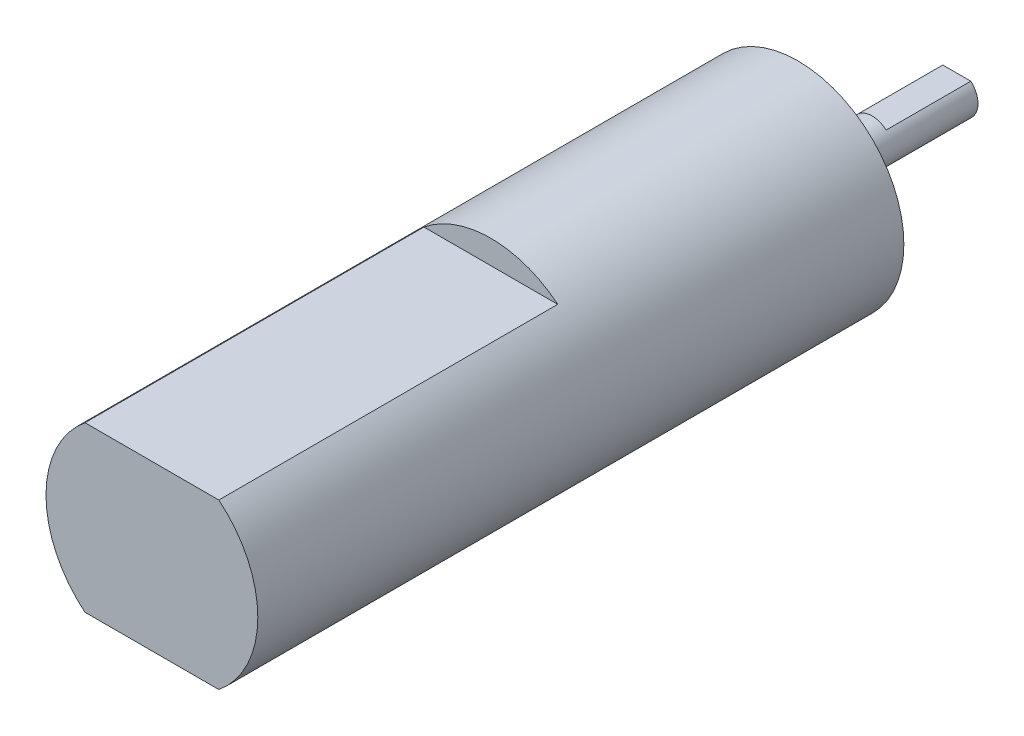
ISO-10303-21;
HEADER;
FILE_DESCRIPTION(('STEP AP214'),'2;1');
FILE_NAME('part.step','',(''),(''),'','','');
FILE_SCHEMA(('AUTOMOTIVE_DESIGN { 1 0 10303 214 1 1 1 1 }'));
ENDSEC;
DATA;
#1=APPLICATION_CONTEXT('core data for automotive mechanical design processes');
#2=APPLICATION_PROTOCOL_DEFINITION('international standard','automotive_design',2000,#1);
#3=PRODUCT_CONTEXT('',#1,'mechanical');
#4=PRODUCT('Part','Part','',(#3));
#5=PRODUCT_RELATED_PRODUCT_CATEGORY('part','',(#4));
#6=PRODUCT_DEFINITION_FORMATION('','',#4);
#7=PRODUCT_DEFINITION_CONTEXT('part definition',#1,'design');
#8=PRODUCT_DEFINITION('design','',#6,#7);
#9=PRODUCT_DEFINITION_SHAPE('','',#8);
#10=(LENGTH_UNIT() NAMED_UNIT(*) SI_UNIT(.MILLI.,.METRE.));
#11=(NAMED_UNIT(*) PLANE_ANGLE_UNIT() SI_UNIT($,.RADIAN.));
#12=(NAMED_UNIT(*) SI_UNIT($,.STERADIAN.) SOLID_ANGLE_UNIT());
#13=UNCERTAINTY_MEASURE_WITH_UNIT(LENGTH_MEASURE(1.E-05),#10,'distance_accuracy_value','');
#14=(GEOMETRIC_REPRESENTATION_CONTEXT(3) GLOBAL_UNCERTAINTY_ASSIGNED_CONTEXT((#13)) GLOBAL_UNIT_ASSIGNED_CONTEXT((#10,
#11,#12)) REPRESENTATION_CONTEXT('',''));
#15=CARTESIAN_POINT('',(0.,0.,0.));
#16=DIRECTION('',(0.,0.,1.));
#17=DIRECTION('',(1.,0.,0.));
#18=AXIS2_PLACEMENT_3D('',#15,#16,#17);
#19=CARTESIAN_POINT('',(0.,0.,-29.));
#20=DIRECTION('',(0.,0.,1.));
#21=DIRECTION('',(1.,0.,0.));
#22=AXIS2_PLACEMENT_3D('',#19,#20,#21);
#23=CYLINDRICAL_SURFACE('',#22,10.);
#24=DIRECTION('',(0.,0.,1.));
#25=VECTOR('',#24,1.);
#26=CARTESIAN_POINT('',(-6.31961232988226,-7.75,-12.8379320764678));
#27=LINE('',#26,#25);
#28=CARTESIAN_POINT('',(-6.31961232988226,-7.75,0.));
#29=VERTEX_POINT('',#28);
#30=CARTESIAN_POINT('',(-6.31961232988226,-7.75,32.));
#31=VERTEX_POINT('',#30);
#32=EDGE_CURVE('E123',#29,#31,#27,.T.);
#33=ORIENTED_EDGE('',*,*,#32,.T.);
#34=CARTESIAN_POINT('',(0.,0.,32.));
#35=DIRECTION('',(0.,0.,1.));
#36=DIRECTION('',(1.,0.,0.));
#37=AXIS2_PLACEMENT_3D('',#34,#35,#36);
#38=CIRCLE('',#37,10.);
#39=CARTESIAN_POINT('',(-6.31961232988226,7.75,32.));
#40=VERTEX_POINT('',#39);
#41=EDGE_CURVE('E142',#40,#31,#38,.T.);
#42=ORIENTED_EDGE('',*,*,#41,.F.);
#43=DIRECTION('',(0.,0.,1.));
#44=VECTOR('',#43,1.);
#45=CARTESIAN_POINT('',(-6.31961232988226,7.75,-12.8379320764678));
#46=LINE('',#45,#44);
#47=CARTESIAN_POINT('',(-6.31961232988226,7.75,0.));
#48=VERTEX_POINT('',#47);
#49=EDGE_CURVE('E137',#48,#40,#46,.T.);
#50=ORIENTED_EDGE('',*,*,#49,.F.);
#51=CARTESIAN_POINT('',(0.,0.,0.));
#52=DIRECTION('',(0.,0.,1.));
#53=DIRECTION('',(1.,0.,0.));
#54=AXIS2_PLACEMENT_3D('',#51,#52,#53);
#55=CIRCLE('',#54,10.);
#56=CARTESIAN_POINT('',(6.31961232988226,7.75,0.));
#57=VERTEX_POINT('',#56);
#58=EDGE_CURVE('E132',#48,#57,#55,.F.);
#59=ORIENTED_EDGE('',*,*,#58,.T.);
#60=DIRECTION('',(0.,0.,1.));
#61=VECTOR('',#60,1.);
#62=CARTESIAN_POINT('',(6.31961232988226,7.75,-12.8379320764678));
#63=LINE('',#62,#61);
#64=CARTESIAN_POINT('',(6.31961232988226,7.75,32.));
#65=VERTEX_POINT('',#64);
#66=EDGE_CURVE('E135',#57,#65,#63,.T.);
#67=ORIENTED_EDGE('',*,*,#66,.T.);
#68=CARTESIAN_POINT('',(6.31961232988226,-7.75,32.));
#69=VERTEX_POINT('',#68);
#70=EDGE_CURVE('E131',#69,#65,#38,.T.);
#71=ORIENTED_EDGE('',*,*,#70,.F.);
#72=DIRECTION('',(0.,0.,1.));
#73=VECTOR('',#72,1.);
#74=CARTESIAN_POINT('',(6.31961232988226,-7.75,-12.8379320764678));
#75=LINE('',#74,#73);
#76=CARTESIAN_POINT('',(6.31961232988226,-7.75,0.));
#77=VERTEX_POINT('',#76);
#78=EDGE_CURVE('E62',#77,#69,#75,.T.);
#79=ORIENTED_EDGE('',*,*,#78,.F.);
#80=CARTESIAN_POINT('',(0.,0.,0.));
#81=DIRECTION('',(0.,0.,1.));
#82=DIRECTION('',(1.,0.,0.));
#83=AXIS2_PLACEMENT_3D('',#80,#81,#82);
#84=CIRCLE('',#83,10.);
#85=EDGE_CURVE('E119',#77,#29,#84,.F.);
#86=ORIENTED_EDGE('',*,*,#85,.T.);
#87=EDGE_LOOP('',(#33,#42,#50,#59,#67,#71,#79,#86));
#88=FACE_BOUND('',#87,.T.);
#89=CARTESIAN_POINT('',(0.,0.,-29.));
#90=DIRECTION('',(0.,0.,1.));
#91=DIRECTION('',(1.,0.,0.));
#92=AXIS2_PLACEMENT_3D('',#89,#90,#91);
#93=CIRCLE('',#92,10.);
#94=CARTESIAN_POINT('',(10.,0.,-29.));
#95=VERTEX_POINT('',#94);
#96=EDGE_CURVE('E41',#95,#95,#93,.T.);
#97=ORIENTED_EDGE('',*,*,#96,.T.);
#98=EDGE_LOOP('',(#97));
#99=FACE_BOUND('',#98,.T.);
#100=ADVANCED_FACE('F38',(#88,#99),#23,.T.);
#101=CARTESIAN_POINT('',(0.,0.,-29.));
#102=DIRECTION('',(0.,0.,1.));
#103=DIRECTION('',(1.,0.,0.));
#104=AXIS2_PLACEMENT_3D('',#101,#102,#103);
#105=PLANE('',#104);
#106=CARTESIAN_POINT('',(0.,0.,-29.));
#107=DIRECTION('',(0.,0.,-1.));
#108=DIRECTION('',(-1.,0.,0.));
#109=AXIS2_PLACEMENT_3D('',#106,#107,#108);
#110=CIRCLE('',#109,5.);
#111=CARTESIAN_POINT('',(-5.,0.,-29.));
#112=VERTEX_POINT('',#111);
#113=EDGE_CURVE('E46',#112,#112,#110,.T.);
#114=ORIENTED_EDGE('',*,*,#113,.F.);
#115=EDGE_LOOP('',(#114));
#116=FACE_BOUND('',#115,.T.);
#117=ORIENTED_EDGE('',*,*,#96,.F.);
#118=EDGE_LOOP('',(#117));
#119=FACE_BOUND('',#118,.T.);
#120=ADVANCED_FACE('F152',(#116,#119),#105,.F.);
#121=CARTESIAN_POINT('',(0.,0.,32.));
#122=DIRECTION('',(0.,0.,1.));
#123=DIRECTION('',(1.,0.,0.));
#124=AXIS2_PLACEMENT_3D('',#121,#122,#123);
#125=PLANE('',#124);
#126=DIRECTION('',(-1.,0.,0.));
#127=VECTOR('',#126,1.);
#128=CARTESIAN_POINT('',(0.,-7.75,32.));
#129=LINE('',#128,#127);
#130=EDGE_CURVE('E124',#69,#31,#129,.T.);
#131=ORIENTED_EDGE('',*,*,#130,.F.);
#132=ORIENTED_EDGE('',*,*,#70,.T.);
#133=DIRECTION('',(1.,0.,0.));
#134=VECTOR('',#133,1.);
#135=CARTESIAN_POINT('',(0.,7.75,32.));
#136=LINE('',#135,#134);
#137=EDGE_CURVE('E116',#40,#65,#136,.T.);
#138=ORIENTED_EDGE('',*,*,#137,.F.);
#139=ORIENTED_EDGE('',*,*,#41,.T.);
#140=EDGE_LOOP('',(#131,#132,#138,#139));
#141=FACE_BOUND('',#140,.T.);
#142=ADVANCED_FACE('F154',(#141),#125,.T.);
#143=CARTESIAN_POINT('',(0.,7.75,-12.8379320764678));
#144=DIRECTION('',(0.,-1.,0.));
#145=DIRECTION('',(0.,0.,-1.));
#146=AXIS2_PLACEMENT_3D('',#143,#144,#145);
#147=PLANE('',#146);
#148=DIRECTION('',(-1.,0.,0.));
#149=VECTOR('',#148,1.);
#150=CARTESIAN_POINT('',(0.,7.75,0.));
#151=LINE('',#150,#149);
#152=EDGE_CURVE('E126',#57,#48,#151,.T.);
#153=ORIENTED_EDGE('',*,*,#152,.T.);
#154=ORIENTED_EDGE('',*,*,#49,.T.);
#155=ORIENTED_EDGE('',*,*,#137,.T.);
#156=ORIENTED_EDGE('',*,*,#66,.F.);
#157=EDGE_LOOP('',(#153,#154,#155,#156));
#158=FACE_BOUND('',#157,.T.);
#159=ADVANCED_FACE('F160',(#158),#147,.F.);
#160=CARTESIAN_POINT('',(0.,0.,0.));
#161=DIRECTION('',(0.,0.,1.));
#162=DIRECTION('',(1.,0.,0.));
#163=AXIS2_PLACEMENT_3D('',#160,#161,#162);
#164=PLANE('',#163);
#165=ORIENTED_EDGE('',*,*,#58,.F.);
#166=ORIENTED_EDGE('',*,*,#152,.F.);
#167=EDGE_LOOP('',(#165,#166));
#168=FACE_BOUND('',#167,.T.);
#169=ADVANCED_FACE('F167',(#168),#164,.T.);
#170=CARTESIAN_POINT('',(0.,-7.75,-12.8379320764678));
#171=DIRECTION('',(0.,1.,0.));
#172=DIRECTION('',(0.,0.,1.));
#173=AXIS2_PLACEMENT_3D('',#170,#171,#172);
#174=PLANE('',#173);
#175=DIRECTION('',(1.,0.,0.));
#176=VECTOR('',#175,1.);
#177=CARTESIAN_POINT('',(0.,-7.75,0.));
#178=LINE('',#177,#176);
#179=EDGE_CURVE('E122',#29,#77,#178,.T.);
#180=ORIENTED_EDGE('',*,*,#179,.T.);
#181=ORIENTED_EDGE('',*,*,#78,.T.);
#182=ORIENTED_EDGE('',*,*,#130,.T.);
#183=ORIENTED_EDGE('',*,*,#32,.F.);
#184=EDGE_LOOP('',(#180,#181,#182,#183));
#185=FACE_BOUND('',#184,.T.);
#186=ADVANCED_FACE('F171',(#185),#174,.F.);
#187=CARTESIAN_POINT('',(0.,0.,0.));
#188=DIRECTION('',(0.,0.,1.));
#189=DIRECTION('',(1.,0.,0.));
#190=AXIS2_PLACEMENT_3D('',#187,#188,#189);
#191=PLANE('',#190);
#192=ORIENTED_EDGE('',*,*,#85,.F.);
#193=ORIENTED_EDGE('',*,*,#179,.F.);
#194=EDGE_LOOP('',(#192,#193));
#195=FACE_BOUND('',#194,.T.);
#196=ADVANCED_FACE('F175',(#195),#191,.T.);
#197=CARTESIAN_POINT('',(0.,0.,-31.));
#198=DIRECTION('',(0.,0.,1.));
#199=DIRECTION('',(1.,0.,0.));
#200=AXIS2_PLACEMENT_3D('',#197,#198,#199);
#201=CYLINDRICAL_SURFACE('',#200,5.);
#202=CARTESIAN_POINT('',(0.,0.,-31.));
#203=DIRECTION('',(0.,0.,-1.));
#204=DIRECTION('',(-1.,0.,0.));
#205=AXIS2_PLACEMENT_3D('',#202,#203,#204);
#206=CIRCLE('',#205,5.);
#207=CARTESIAN_POINT('',(-5.,0.,-31.));
#208=VERTEX_POINT('',#207);
#209=EDGE_CURVE('E112',#208,#208,#206,.T.);
#210=ORIENTED_EDGE('',*,*,#209,.F.);
#211=EDGE_LOOP('',(#210));
#212=FACE_BOUND('',#211,.T.);
#213=ORIENTED_EDGE('',*,*,#113,.T.);
#214=EDGE_LOOP('',(#213));
#215=FACE_BOUND('',#214,.T.);
#216=ADVANCED_FACE('F178',(#212,#215),#201,.T.);
#217=CARTESIAN_POINT('',(0.,0.,-31.));
#218=DIRECTION('',(0.,0.,-1.));
#219=DIRECTION('',(-1.,0.,0.));
#220=AXIS2_PLACEMENT_3D('',#217,#218,#219);
#221=PLANE('',#220);
#222=CARTESIAN_POINT('',(0.,0.,-31.));
#223=DIRECTION('',(0.,0.,-1.));
#224=DIRECTION('',(-1.,0.,0.));
#225=AXIS2_PLACEMENT_3D('',#222,#223,#224);
#226=CIRCLE('',#225,2.);
#227=CARTESIAN_POINT('',(-2.,0.,-31.));
#228=VERTEX_POINT('',#227);
#229=EDGE_CURVE('E11',#228,#228,#226,.T.);
#230=ORIENTED_EDGE('',*,*,#229,.F.);
#231=EDGE_LOOP('',(#230));
#232=FACE_BOUND('',#231,.T.);
#233=ORIENTED_EDGE('',*,*,#209,.T.);
#234=EDGE_LOOP('',(#233));
#235=FACE_BOUND('',#234,.T.);
#236=ADVANCED_FACE('F182',(#232,#235),#221,.T.);
#237=CARTESIAN_POINT('',(0.,0.,-44.));
#238=DIRECTION('',(0.,0.,1.));
#239=DIRECTION('',(1.,0.,0.));
#240=AXIS2_PLACEMENT_3D('',#237,#238,#239);
#241=CYLINDRICAL_SURFACE('',#240,2.);
#242=CARTESIAN_POINT('',(0.,0.,-44.));
#243=DIRECTION('',(0.,0.,-1.));
#244=DIRECTION('',(-1.,0.,0.));
#245=AXIS2_PLACEMENT_3D('',#242,#243,#244);
#246=CIRCLE('',#245,2.);
#247=CARTESIAN_POINT('',(1.32287565553229,1.5,-44.));
#248=VERTEX_POINT('',#247);
#249=CARTESIAN_POINT('',(-1.32287565553229,1.5,-44.));
#250=VERTEX_POINT('',#249);
#251=EDGE_CURVE('E107',#248,#250,#246,.T.);
#252=ORIENTED_EDGE('',*,*,#251,.F.);
#253=DIRECTION('',(0.,0.,-1.));
#254=VECTOR('',#253,1.);
#255=CARTESIAN_POINT('',(1.32287565553229,1.5,-36.));
#256=LINE('',#255,#254);
#257=CARTESIAN_POINT('',(1.32287565553229,1.5,-36.));
#258=VERTEX_POINT('',#257);
#259=EDGE_CURVE('E54',#258,#248,#256,.T.);
#260=ORIENTED_EDGE('',*,*,#259,.F.);
#261=CARTESIAN_POINT('',(0.,0.,-36.));
#262=DIRECTION('',(0.,0.,-1.));
#263=DIRECTION('',(-1.,0.,0.));
#264=AXIS2_PLACEMENT_3D('',#261,#262,#263);
#265=CIRCLE('',#264,2.);
#266=CARTESIAN_POINT('',(-1.32287565553229,1.5,-36.));
#267=VERTEX_POINT('',#266);
#268=EDGE_CURVE('E93',#267,#258,#265,.T.);
#269=ORIENTED_EDGE('',*,*,#268,.F.);
#270=DIRECTION('',(0.,0.,-1.));
#271=VECTOR('',#270,1.);
#272=CARTESIAN_POINT('',(-1.32287565553229,1.5,-36.));
#273=LINE('',#272,#271);
#274=EDGE_CURVE('E101',#267,#250,#273,.T.);
#275=ORIENTED_EDGE('',*,*,#274,.T.);
#276=EDGE_LOOP('',(#252,#260,#269,#275));
#277=FACE_BOUND('',#276,.T.);
#278=ORIENTED_EDGE('',*,*,#229,.T.);
#279=EDGE_LOOP('',(#278));
#280=FACE_BOUND('',#279,.T.);
#281=ADVANCED_FACE('F104',(#277,#280),#241,.T.);
#282=CARTESIAN_POINT('',(0.,0.,-44.));
#283=DIRECTION('',(0.,0.,-1.));
#284=DIRECTION('',(-1.,0.,0.));
#285=AXIS2_PLACEMENT_3D('',#282,#283,#284);
#286=PLANE('',#285);
#287=DIRECTION('',(-1.,0.,0.));
#288=VECTOR('',#287,1.);
#289=CARTESIAN_POINT('',(0.,1.5,-44.));
#290=LINE('',#289,#288);
#291=EDGE_CURVE('E98',#248,#250,#290,.T.);
#292=ORIENTED_EDGE('',*,*,#291,.F.);
#293=ORIENTED_EDGE('',*,*,#251,.T.);
#294=EDGE_LOOP('',(#292,#293));
#295=FACE_BOUND('',#294,.T.);
#296=ADVANCED_FACE('F189',(#295),#286,.T.);
#297=CARTESIAN_POINT('',(0.,1.5,-36.));
#298=DIRECTION('',(0.,-1.,0.));
#299=DIRECTION('',(0.,0.,-1.));
#300=AXIS2_PLACEMENT_3D('',#297,#298,#299);
#301=PLANE('',#300);
#302=ORIENTED_EDGE('',*,*,#291,.T.);
#303=ORIENTED_EDGE('',*,*,#274,.F.);
#304=DIRECTION('',(-1.,0.,0.));
#305=VECTOR('',#304,1.);
#306=CARTESIAN_POINT('',(0.,1.5,-36.));
#307=LINE('',#306,#305);
#308=EDGE_CURVE('E95',#258,#267,#307,.T.);
#309=ORIENTED_EDGE('',*,*,#308,.F.);
#310=ORIENTED_EDGE('',*,*,#259,.T.);
#311=EDGE_LOOP('',(#302,#303,#309,#310));
#312=FACE_BOUND('',#311,.T.);
#313=ADVANCED_FACE('F100',(#312),#301,.F.);
#314=CARTESIAN_POINT('',(0.,0.,-36.));
#315=DIRECTION('',(0.,0.,-1.));
#316=DIRECTION('',(-1.,0.,0.));
#317=AXIS2_PLACEMENT_3D('',#314,#315,#316);
#318=PLANE('',#317);
#319=ORIENTED_EDGE('',*,*,#268,.T.);
#320=ORIENTED_EDGE('',*,*,#308,.T.);
#321=EDGE_LOOP('',(#319,#320));
#322=FACE_BOUND('',#321,.T.);
#323=ADVANCED_FACE('F94',(#322),#318,.T.);
#324=CLOSED_SHELL('',(#100,#120,#142,#159,#169,#186,#196,#216,#236,#281,#296,#313,#323));
#325=MANIFOLD_SOLID_BREP('B2',#324);
#326=ADVANCED_BREP_SHAPE_REPRESENTATION('',(#18,#325),#14);
#327=SHAPE_DEFINITION_REPRESENTATION(#9,#326);
ENDSEC;
END-ISO-10303-21;
